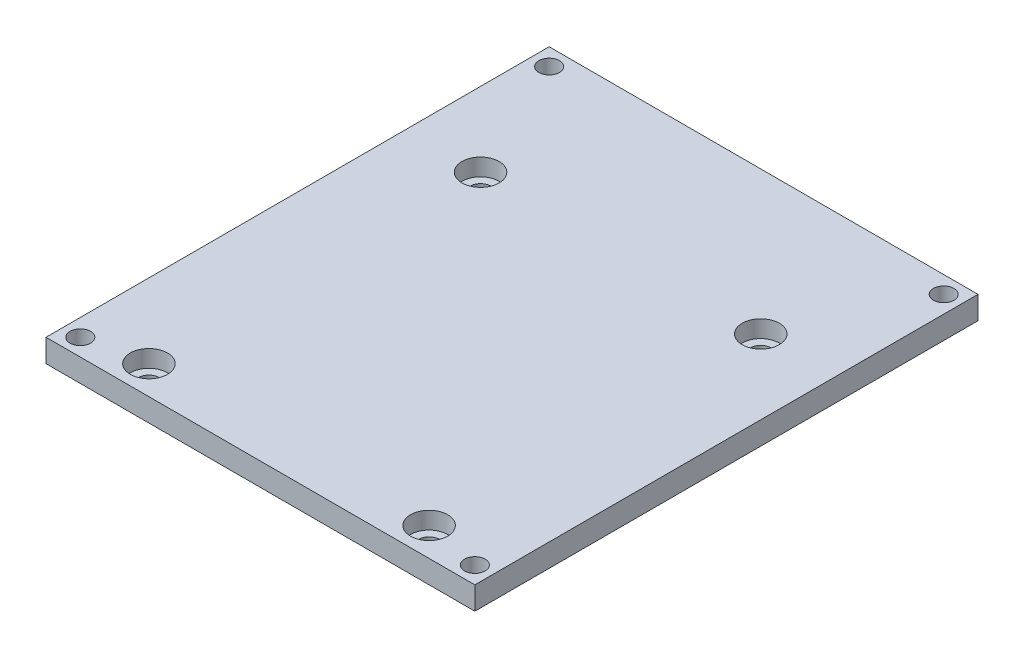
ISO-10303-21;
HEADER;
FILE_DESCRIPTION(('STEP AP214'),'2;1');
FILE_NAME('part.step','',(''),(''),'','','');
FILE_SCHEMA(('AUTOMOTIVE_DESIGN { 1 0 10303 214 1 1 1 1 }'));
ENDSEC;
DATA;
#1=APPLICATION_CONTEXT('core data for automotive mechanical design processes');
#2=APPLICATION_PROTOCOL_DEFINITION('international standard','automotive_design',2000,#1);
#3=PRODUCT_CONTEXT('',#1,'mechanical');
#4=PRODUCT('Part','Part','',(#3));
#5=PRODUCT_RELATED_PRODUCT_CATEGORY('part','',(#4));
#6=PRODUCT_DEFINITION_FORMATION('','',#4);
#7=PRODUCT_DEFINITION_CONTEXT('part definition',#1,'design');
#8=PRODUCT_DEFINITION('design','',#6,#7);
#9=PRODUCT_DEFINITION_SHAPE('','',#8);
#10=(LENGTH_UNIT() NAMED_UNIT(*) SI_UNIT(.MILLI.,.METRE.));
#11=(NAMED_UNIT(*) PLANE_ANGLE_UNIT() SI_UNIT($,.RADIAN.));
#12=(NAMED_UNIT(*) SI_UNIT($,.STERADIAN.) SOLID_ANGLE_UNIT());
#13=UNCERTAINTY_MEASURE_WITH_UNIT(LENGTH_MEASURE(1.E-05),#10,'distance_accuracy_value','');
#14=(GEOMETRIC_REPRESENTATION_CONTEXT(3) GLOBAL_UNCERTAINTY_ASSIGNED_CONTEXT((#13)) GLOBAL_UNIT_ASSIGNED_CONTEXT((#10,
#11,#12)) REPRESENTATION_CONTEXT('',''));
#15=CARTESIAN_POINT('',(0.,0.,0.));
#16=DIRECTION('',(0.,0.,1.));
#17=DIRECTION('',(1.,0.,0.));
#18=AXIS2_PLACEMENT_3D('',#15,#16,#17);
#19=CARTESIAN_POINT('',(37.5,4.,44.));
#20=DIRECTION('',(-1.,0.,0.));
#21=DIRECTION('',(0.,0.,1.));
#22=AXIS2_PLACEMENT_3D('',#19,#20,#21);
#23=PLANE('',#22);
#24=DIRECTION('',(0.,0.,-1.));
#25=VECTOR('',#24,1.);
#26=CARTESIAN_POINT('',(37.5,0.,44.));
#27=LINE('',#26,#25);
#28=CARTESIAN_POINT('',(37.5,0.,44.));
#29=VERTEX_POINT('',#28);
#30=CARTESIAN_POINT('',(37.5,0.,-44.));
#31=VERTEX_POINT('',#30);
#32=EDGE_CURVE('E102',#29,#31,#27,.T.);
#33=ORIENTED_EDGE('',*,*,#32,.T.);
#34=DIRECTION('',(0.,-1.,0.));
#35=VECTOR('',#34,1.);
#36=CARTESIAN_POINT('',(37.5,4.,-44.));
#37=LINE('',#36,#35);
#38=CARTESIAN_POINT('',(37.5,4.,-44.));
#39=VERTEX_POINT('',#38);
#40=EDGE_CURVE('E11',#39,#31,#37,.T.);
#41=ORIENTED_EDGE('',*,*,#40,.F.);
#42=DIRECTION('',(0.,0.,-1.));
#43=VECTOR('',#42,1.);
#44=CARTESIAN_POINT('',(37.5,4.,44.));
#45=LINE('',#44,#43);
#46=CARTESIAN_POINT('',(37.5,4.,44.));
#47=VERTEX_POINT('',#46);
#48=EDGE_CURVE('E90',#47,#39,#45,.T.);
#49=ORIENTED_EDGE('',*,*,#48,.F.);
#50=DIRECTION('',(0.,-1.,0.));
#51=VECTOR('',#50,1.);
#52=CARTESIAN_POINT('',(37.5,4.,44.));
#53=LINE('',#52,#51);
#54=EDGE_CURVE('E98',#47,#29,#53,.T.);
#55=ORIENTED_EDGE('',*,*,#54,.T.);
#56=EDGE_LOOP('',(#33,#41,#49,#55));
#57=FACE_BOUND('',#56,.T.);
#58=ADVANCED_FACE('F39',(#57),#23,.F.);
#59=CARTESIAN_POINT('',(-37.5,4.,-44.));
#60=DIRECTION('',(0.,0.,1.));
#61=DIRECTION('',(1.,0.,0.));
#62=AXIS2_PLACEMENT_3D('',#59,#60,#61);
#63=PLANE('',#62);
#64=DIRECTION('',(-1.,0.,0.));
#65=VECTOR('',#64,1.);
#66=CARTESIAN_POINT('',(-37.5,0.,-44.));
#67=LINE('',#66,#65);
#68=CARTESIAN_POINT('',(-37.5,0.,-44.));
#69=VERTEX_POINT('',#68);
#70=EDGE_CURVE('E94',#31,#69,#67,.T.);
#71=ORIENTED_EDGE('',*,*,#70,.T.);
#72=DIRECTION('',(0.,-1.,0.));
#73=VECTOR('',#72,1.);
#74=CARTESIAN_POINT('',(-37.5,4.,-44.));
#75=LINE('',#74,#73);
#76=CARTESIAN_POINT('',(-37.5,4.,-44.));
#77=VERTEX_POINT('',#76);
#78=EDGE_CURVE('E47',#77,#69,#75,.T.);
#79=ORIENTED_EDGE('',*,*,#78,.F.);
#80=DIRECTION('',(-1.,0.,0.));
#81=VECTOR('',#80,1.);
#82=CARTESIAN_POINT('',(-37.5,4.,-44.));
#83=LINE('',#82,#81);
#84=EDGE_CURVE('E85',#39,#77,#83,.T.);
#85=ORIENTED_EDGE('',*,*,#84,.F.);
#86=ORIENTED_EDGE('',*,*,#40,.T.);
#87=EDGE_LOOP('',(#71,#79,#85,#86));
#88=FACE_BOUND('',#87,.T.);
#89=ADVANCED_FACE('F93',(#88),#63,.F.);
#90=CARTESIAN_POINT('',(-37.5,4.,44.));
#91=DIRECTION('',(1.,0.,0.));
#92=DIRECTION('',(0.,0.,-1.));
#93=AXIS2_PLACEMENT_3D('',#90,#91,#92);
#94=PLANE('',#93);
#95=DIRECTION('',(0.,0.,1.));
#96=VECTOR('',#95,1.);
#97=CARTESIAN_POINT('',(-37.5,0.,44.));
#98=LINE('',#97,#96);
#99=CARTESIAN_POINT('',(-37.5,0.,44.));
#100=VERTEX_POINT('',#99);
#101=EDGE_CURVE('E72',#69,#100,#98,.T.);
#102=ORIENTED_EDGE('',*,*,#101,.T.);
#103=DIRECTION('',(0.,-1.,0.));
#104=VECTOR('',#103,1.);
#105=CARTESIAN_POINT('',(-37.5,4.,44.));
#106=LINE('',#105,#104);
#107=CARTESIAN_POINT('',(-37.5,4.,44.));
#108=VERTEX_POINT('',#107);
#109=EDGE_CURVE('E95',#108,#100,#106,.T.);
#110=ORIENTED_EDGE('',*,*,#109,.F.);
#111=DIRECTION('',(0.,0.,1.));
#112=VECTOR('',#111,1.);
#113=CARTESIAN_POINT('',(-37.5,4.,44.));
#114=LINE('',#113,#112);
#115=EDGE_CURVE('E88',#77,#108,#114,.T.);
#116=ORIENTED_EDGE('',*,*,#115,.F.);
#117=ORIENTED_EDGE('',*,*,#78,.T.);
#118=EDGE_LOOP('',(#102,#110,#116,#117));
#119=FACE_BOUND('',#118,.T.);
#120=ADVANCED_FACE('F96',(#119),#94,.F.);
#121=CARTESIAN_POINT('',(-37.5,4.,44.));
#122=DIRECTION('',(0.,0.,-1.));
#123=DIRECTION('',(-1.,0.,0.));
#124=AXIS2_PLACEMENT_3D('',#121,#122,#123);
#125=PLANE('',#124);
#126=DIRECTION('',(1.,0.,0.));
#127=VECTOR('',#126,1.);
#128=CARTESIAN_POINT('',(-37.5,0.,44.));
#129=LINE('',#128,#127);
#130=EDGE_CURVE('E78',#100,#29,#129,.T.);
#131=ORIENTED_EDGE('',*,*,#130,.T.);
#132=ORIENTED_EDGE('',*,*,#54,.F.);
#133=DIRECTION('',(1.,0.,0.));
#134=VECTOR('',#133,1.);
#135=CARTESIAN_POINT('',(-37.5,4.,44.));
#136=LINE('',#135,#134);
#137=EDGE_CURVE('E55',#108,#47,#136,.T.);
#138=ORIENTED_EDGE('',*,*,#137,.F.);
#139=ORIENTED_EDGE('',*,*,#109,.T.);
#140=EDGE_LOOP('',(#131,#132,#138,#139));
#141=FACE_BOUND('',#140,.T.);
#142=ADVANCED_FACE('F110',(#141),#125,.F.);
#143=CARTESIAN_POINT('',(0.,4.,0.));
#144=DIRECTION('',(0.,-1.,0.));
#145=DIRECTION('',(0.,0.,-1.));
#146=AXIS2_PLACEMENT_3D('',#143,#144,#145);
#147=PLANE('',#146);
#148=CARTESIAN_POINT('',(-34.5,4.,-41.));
#149=DIRECTION('',(0.,1.,0.));
#150=DIRECTION('',(0.,0.,1.));
#151=AXIS2_PLACEMENT_3D('',#148,#149,#150);
#152=CIRCLE('',#151,1.8);
#153=CARTESIAN_POINT('',(-34.5,4.,-39.2));
#154=VERTEX_POINT('',#153);
#155=EDGE_CURVE('E184',#154,#154,#152,.T.);
#156=ORIENTED_EDGE('',*,*,#155,.F.);
#157=EDGE_LOOP('',(#156));
#158=FACE_BOUND('',#157,.T.);
#159=CARTESIAN_POINT('',(34.5,4.,41.));
#160=DIRECTION('',(0.,1.,0.));
#161=DIRECTION('',(0.,0.,1.));
#162=AXIS2_PLACEMENT_3D('',#159,#160,#161);
#163=CIRCLE('',#162,1.8);
#164=CARTESIAN_POINT('',(34.5,4.,42.8));
#165=VERTEX_POINT('',#164);
#166=EDGE_CURVE('E178',#165,#165,#163,.T.);
#167=ORIENTED_EDGE('',*,*,#166,.F.);
#168=EDGE_LOOP('',(#167));
#169=FACE_BOUND('',#168,.T.);
#170=CARTESIAN_POINT('',(34.5,4.,-41.));
#171=DIRECTION('',(0.,1.,0.));
#172=DIRECTION('',(0.,0.,1.));
#173=AXIS2_PLACEMENT_3D('',#170,#171,#172);
#174=CIRCLE('',#173,1.8);
#175=CARTESIAN_POINT('',(34.5,4.,-39.2));
#176=VERTEX_POINT('',#175);
#177=EDGE_CURVE('E172',#176,#176,#174,.T.);
#178=ORIENTED_EDGE('',*,*,#177,.F.);
#179=EDGE_LOOP('',(#178));
#180=FACE_BOUND('',#179,.T.);
#181=CARTESIAN_POINT('',(-34.5,4.,41.));
#182=DIRECTION('',(0.,1.,0.));
#183=DIRECTION('',(0.,0.,1.));
#184=AXIS2_PLACEMENT_3D('',#181,#182,#183);
#185=CIRCLE('',#184,1.8);
#186=CARTESIAN_POINT('',(-34.5,4.,42.8));
#187=VERTEX_POINT('',#186);
#188=EDGE_CURVE('E166',#187,#187,#185,.T.);
#189=ORIENTED_EDGE('',*,*,#188,.F.);
#190=EDGE_LOOP('',(#189));
#191=FACE_BOUND('',#190,.T.);
#192=CARTESIAN_POINT('',(24.5,4.,-19.));
#193=DIRECTION('',(0.,1.,0.));
#194=DIRECTION('',(0.,0.,1.));
#195=AXIS2_PLACEMENT_3D('',#192,#193,#194);
#196=CIRCLE('',#195,3.25);
#197=CARTESIAN_POINT('',(24.5,4.,-15.75));
#198=VERTEX_POINT('',#197);
#199=EDGE_CURVE('E160',#198,#198,#196,.T.);
#200=ORIENTED_EDGE('',*,*,#199,.F.);
#201=EDGE_LOOP('',(#200));
#202=FACE_BOUND('',#201,.T.);
#203=CARTESIAN_POINT('',(-24.5,4.,39.));
#204=DIRECTION('',(0.,1.,0.));
#205=DIRECTION('',(0.,0.,1.));
#206=AXIS2_PLACEMENT_3D('',#203,#204,#205);
#207=CIRCLE('',#206,3.25);
#208=CARTESIAN_POINT('',(-24.5,4.,42.25));
#209=VERTEX_POINT('',#208);
#210=EDGE_CURVE('E148',#209,#209,#207,.T.);
#211=ORIENTED_EDGE('',*,*,#210,.F.);
#212=EDGE_LOOP('',(#211));
#213=FACE_BOUND('',#212,.T.);
#214=CARTESIAN_POINT('',(-24.5,4.,-19.));
#215=DIRECTION('',(0.,1.,0.));
#216=DIRECTION('',(0.,0.,1.));
#217=AXIS2_PLACEMENT_3D('',#214,#215,#216);
#218=CIRCLE('',#217,3.25);
#219=CARTESIAN_POINT('',(-24.5,4.,-15.75));
#220=VERTEX_POINT('',#219);
#221=EDGE_CURVE('E136',#220,#220,#218,.T.);
#222=ORIENTED_EDGE('',*,*,#221,.F.);
#223=EDGE_LOOP('',(#222));
#224=FACE_BOUND('',#223,.T.);
#225=CARTESIAN_POINT('',(24.5,4.,39.));
#226=DIRECTION('',(0.,1.,0.));
#227=DIRECTION('',(0.,0.,1.));
#228=AXIS2_PLACEMENT_3D('',#225,#226,#227);
#229=CIRCLE('',#228,3.25);
#230=CARTESIAN_POINT('',(24.5,4.,42.25));
#231=VERTEX_POINT('',#230);
#232=EDGE_CURVE('E124',#231,#231,#229,.T.);
#233=ORIENTED_EDGE('',*,*,#232,.F.);
#234=EDGE_LOOP('',(#233));
#235=FACE_BOUND('',#234,.T.);
#236=ORIENTED_EDGE('',*,*,#48,.T.);
#237=ORIENTED_EDGE('',*,*,#84,.T.);
#238=ORIENTED_EDGE('',*,*,#115,.T.);
#239=ORIENTED_EDGE('',*,*,#137,.T.);
#240=EDGE_LOOP('',(#236,#237,#238,#239));
#241=FACE_BOUND('',#240,.T.);
#242=ADVANCED_FACE('F86',(#158,#169,#180,#191,#202,#213,#224,#235,#241),#147,.F.);
#243=CARTESIAN_POINT('',(0.,0.,0.));
#244=DIRECTION('',(0.,-1.,0.));
#245=DIRECTION('',(0.,0.,-1.));
#246=AXIS2_PLACEMENT_3D('',#243,#244,#245);
#247=PLANE('',#246);
#248=CARTESIAN_POINT('',(-34.5,0.,-41.));
#249=DIRECTION('',(0.,1.,0.));
#250=DIRECTION('',(0.,0.,1.));
#251=AXIS2_PLACEMENT_3D('',#248,#249,#250);
#252=CIRCLE('',#251,1.8);
#253=CARTESIAN_POINT('',(-34.5,0.,-39.2));
#254=VERTEX_POINT('',#253);
#255=EDGE_CURVE('E181',#254,#254,#252,.T.);
#256=ORIENTED_EDGE('',*,*,#255,.T.);
#257=EDGE_LOOP('',(#256));
#258=FACE_BOUND('',#257,.T.);
#259=CARTESIAN_POINT('',(34.5,0.,41.));
#260=DIRECTION('',(0.,1.,0.));
#261=DIRECTION('',(0.,0.,1.));
#262=AXIS2_PLACEMENT_3D('',#259,#260,#261);
#263=CIRCLE('',#262,1.8);
#264=CARTESIAN_POINT('',(34.5,0.,42.8));
#265=VERTEX_POINT('',#264);
#266=EDGE_CURVE('E175',#265,#265,#263,.T.);
#267=ORIENTED_EDGE('',*,*,#266,.T.);
#268=EDGE_LOOP('',(#267));
#269=FACE_BOUND('',#268,.T.);
#270=CARTESIAN_POINT('',(34.5,0.,-41.));
#271=DIRECTION('',(0.,1.,0.));
#272=DIRECTION('',(0.,0.,1.));
#273=AXIS2_PLACEMENT_3D('',#270,#271,#272);
#274=CIRCLE('',#273,1.8);
#275=CARTESIAN_POINT('',(34.5,0.,-39.2));
#276=VERTEX_POINT('',#275);
#277=EDGE_CURVE('E169',#276,#276,#274,.T.);
#278=ORIENTED_EDGE('',*,*,#277,.T.);
#279=EDGE_LOOP('',(#278));
#280=FACE_BOUND('',#279,.T.);
#281=CARTESIAN_POINT('',(-34.5,0.,41.));
#282=DIRECTION('',(0.,1.,0.));
#283=DIRECTION('',(0.,0.,1.));
#284=AXIS2_PLACEMENT_3D('',#281,#282,#283);
#285=CIRCLE('',#284,1.8);
#286=CARTESIAN_POINT('',(-34.5,0.,42.8));
#287=VERTEX_POINT('',#286);
#288=EDGE_CURVE('E163',#287,#287,#285,.T.);
#289=ORIENTED_EDGE('',*,*,#288,.T.);
#290=EDGE_LOOP('',(#289));
#291=FACE_BOUND('',#290,.T.);
#292=CARTESIAN_POINT('',(24.5,0.,-19.));
#293=DIRECTION('',(0.,1.,0.));
#294=DIRECTION('',(0.,0.,1.));
#295=AXIS2_PLACEMENT_3D('',#292,#293,#294);
#296=CIRCLE('',#295,1.8);
#297=CARTESIAN_POINT('',(24.5,0.,-17.2));
#298=VERTEX_POINT('',#297);
#299=EDGE_CURVE('E151',#298,#298,#296,.T.);
#300=ORIENTED_EDGE('',*,*,#299,.T.);
#301=EDGE_LOOP('',(#300));
#302=FACE_BOUND('',#301,.T.);
#303=CARTESIAN_POINT('',(-24.5,0.,39.));
#304=DIRECTION('',(0.,1.,0.));
#305=DIRECTION('',(0.,0.,1.));
#306=AXIS2_PLACEMENT_3D('',#303,#304,#305);
#307=CIRCLE('',#306,1.8);
#308=CARTESIAN_POINT('',(-24.5,0.,40.8));
#309=VERTEX_POINT('',#308);
#310=EDGE_CURVE('E139',#309,#309,#307,.T.);
#311=ORIENTED_EDGE('',*,*,#310,.T.);
#312=EDGE_LOOP('',(#311));
#313=FACE_BOUND('',#312,.T.);
#314=CARTESIAN_POINT('',(-24.5,0.,-19.));
#315=DIRECTION('',(0.,1.,0.));
#316=DIRECTION('',(0.,0.,1.));
#317=AXIS2_PLACEMENT_3D('',#314,#315,#316);
#318=CIRCLE('',#317,1.8);
#319=CARTESIAN_POINT('',(-24.5,0.,-17.2));
#320=VERTEX_POINT('',#319);
#321=EDGE_CURVE('E127',#320,#320,#318,.T.);
#322=ORIENTED_EDGE('',*,*,#321,.T.);
#323=EDGE_LOOP('',(#322));
#324=FACE_BOUND('',#323,.T.);
#325=CARTESIAN_POINT('',(24.5,0.,39.));
#326=DIRECTION('',(0.,1.,0.));
#327=DIRECTION('',(0.,0.,1.));
#328=AXIS2_PLACEMENT_3D('',#325,#326,#327);
#329=CIRCLE('',#328,1.8);
#330=CARTESIAN_POINT('',(24.5,0.,40.8));
#331=VERTEX_POINT('',#330);
#332=EDGE_CURVE('E105',#331,#331,#329,.T.);
#333=ORIENTED_EDGE('',*,*,#332,.T.);
#334=EDGE_LOOP('',(#333));
#335=FACE_BOUND('',#334,.T.);
#336=ORIENTED_EDGE('',*,*,#32,.F.);
#337=ORIENTED_EDGE('',*,*,#130,.F.);
#338=ORIENTED_EDGE('',*,*,#101,.F.);
#339=ORIENTED_EDGE('',*,*,#70,.F.);
#340=EDGE_LOOP('',(#336,#337,#338,#339));
#341=FACE_BOUND('',#340,.T.);
#342=ADVANCED_FACE('F113',(#258,#269,#280,#291,#302,#313,#324,#335,#341),#247,.T.);
#343=CARTESIAN_POINT('',(24.5,4.,39.));
#344=DIRECTION('',(0.,1.,0.));
#345=DIRECTION('',(0.,0.,1.));
#346=AXIS2_PLACEMENT_3D('',#343,#344,#345);
#347=CYLINDRICAL_SURFACE('',#346,1.8);
#348=ORIENTED_EDGE('',*,*,#332,.F.);
#349=EDGE_LOOP('',(#348));
#350=FACE_BOUND('',#349,.T.);
#351=CARTESIAN_POINT('',(24.5,1.,39.));
#352=DIRECTION('',(0.,1.,0.));
#353=DIRECTION('',(0.,0.,1.));
#354=AXIS2_PLACEMENT_3D('',#351,#352,#353);
#355=CIRCLE('',#354,1.8);
#356=CARTESIAN_POINT('',(24.5,1.,40.8));
#357=VERTEX_POINT('',#356);
#358=EDGE_CURVE('E118',#357,#357,#355,.T.);
#359=ORIENTED_EDGE('',*,*,#358,.T.);
#360=EDGE_LOOP('',(#359));
#361=FACE_BOUND('',#360,.T.);
#362=ADVANCED_FACE('F220',(#350,#361),#347,.F.);
#363=CARTESIAN_POINT('',(26.3,1.,39.));
#364=DIRECTION('',(0.,-1.,0.));
#365=DIRECTION('',(0.,0.,-1.));
#366=AXIS2_PLACEMENT_3D('',#363,#364,#365);
#367=PLANE('',#366);
#368=ORIENTED_EDGE('',*,*,#358,.F.);
#369=EDGE_LOOP('',(#368));
#370=FACE_BOUND('',#369,.T.);
#371=CARTESIAN_POINT('',(24.5,1.,39.));
#372=DIRECTION('',(0.,1.,0.));
#373=DIRECTION('',(0.,0.,1.));
#374=AXIS2_PLACEMENT_3D('',#371,#372,#373);
#375=CIRCLE('',#374,3.25);
#376=CARTESIAN_POINT('',(24.5,1.,42.25));
#377=VERTEX_POINT('',#376);
#378=EDGE_CURVE('E121',#377,#377,#375,.T.);
#379=ORIENTED_EDGE('',*,*,#378,.T.);
#380=EDGE_LOOP('',(#379));
#381=FACE_BOUND('',#380,.T.);
#382=ADVANCED_FACE('F210',(#370,#381),#367,.F.);
#383=CARTESIAN_POINT('',(24.5,4.,39.));
#384=DIRECTION('',(0.,1.,0.));
#385=DIRECTION('',(0.,0.,1.));
#386=AXIS2_PLACEMENT_3D('',#383,#384,#385);
#387=CYLINDRICAL_SURFACE('',#386,3.25);
#388=ORIENTED_EDGE('',*,*,#378,.F.);
#389=EDGE_LOOP('',(#388));
#390=FACE_BOUND('',#389,.T.);
#391=ORIENTED_EDGE('',*,*,#232,.T.);
#392=EDGE_LOOP('',(#391));
#393=FACE_BOUND('',#392,.T.);
#394=ADVANCED_FACE('F207',(#390,#393),#387,.F.);
#395=CARTESIAN_POINT('',(-24.5,4.,-19.));
#396=DIRECTION('',(0.,1.,0.));
#397=DIRECTION('',(0.,0.,1.));
#398=AXIS2_PLACEMENT_3D('',#395,#396,#397);
#399=CYLINDRICAL_SURFACE('',#398,1.8);
#400=ORIENTED_EDGE('',*,*,#321,.F.);
#401=EDGE_LOOP('',(#400));
#402=FACE_BOUND('',#401,.T.);
#403=CARTESIAN_POINT('',(-24.5,1.,-19.));
#404=DIRECTION('',(0.,1.,0.));
#405=DIRECTION('',(0.,0.,1.));
#406=AXIS2_PLACEMENT_3D('',#403,#404,#405);
#407=CIRCLE('',#406,1.8);
#408=CARTESIAN_POINT('',(-24.5,1.,-17.2));
#409=VERTEX_POINT('',#408);
#410=EDGE_CURVE('E130',#409,#409,#407,.T.);
#411=ORIENTED_EDGE('',*,*,#410,.T.);
#412=EDGE_LOOP('',(#411));
#413=FACE_BOUND('',#412,.T.);
#414=ADVANCED_FACE('F209',(#402,#413),#399,.F.);
#415=CARTESIAN_POINT('',(-22.7,1.,-19.));
#416=DIRECTION('',(0.,-1.,0.));
#417=DIRECTION('',(0.,0.,-1.));
#418=AXIS2_PLACEMENT_3D('',#415,#416,#417);
#419=PLANE('',#418);
#420=ORIENTED_EDGE('',*,*,#410,.F.);
#421=EDGE_LOOP('',(#420));
#422=FACE_BOUND('',#421,.T.);
#423=CARTESIAN_POINT('',(-24.5,1.,-19.));
#424=DIRECTION('',(0.,1.,0.));
#425=DIRECTION('',(0.,0.,1.));
#426=AXIS2_PLACEMENT_3D('',#423,#424,#425);
#427=CIRCLE('',#426,3.25);
#428=CARTESIAN_POINT('',(-24.5,1.,-15.75));
#429=VERTEX_POINT('',#428);
#430=EDGE_CURVE('E133',#429,#429,#427,.T.);
#431=ORIENTED_EDGE('',*,*,#430,.T.);
#432=EDGE_LOOP('',(#431));
#433=FACE_BOUND('',#432,.T.);
#434=ADVANCED_FACE('F217',(#422,#433),#419,.F.);
#435=CARTESIAN_POINT('',(-24.5,4.,-19.));
#436=DIRECTION('',(0.,1.,0.));
#437=DIRECTION('',(0.,0.,1.));
#438=AXIS2_PLACEMENT_3D('',#435,#436,#437);
#439=CYLINDRICAL_SURFACE('',#438,3.25);
#440=ORIENTED_EDGE('',*,*,#430,.F.);
#441=EDGE_LOOP('',(#440));
#442=FACE_BOUND('',#441,.T.);
#443=ORIENTED_EDGE('',*,*,#221,.T.);
#444=EDGE_LOOP('',(#443));
#445=FACE_BOUND('',#444,.T.);
#446=ADVANCED_FACE('F275',(#442,#445),#439,.F.);
#447=CARTESIAN_POINT('',(-24.5,4.,39.));
#448=DIRECTION('',(0.,1.,0.));
#449=DIRECTION('',(0.,0.,1.));
#450=AXIS2_PLACEMENT_3D('',#447,#448,#449);
#451=CYLINDRICAL_SURFACE('',#450,1.8);
#452=ORIENTED_EDGE('',*,*,#310,.F.);
#453=EDGE_LOOP('',(#452));
#454=FACE_BOUND('',#453,.T.);
#455=CARTESIAN_POINT('',(-24.5,1.,39.));
#456=DIRECTION('',(0.,1.,0.));
#457=DIRECTION('',(0.,0.,1.));
#458=AXIS2_PLACEMENT_3D('',#455,#456,#457);
#459=CIRCLE('',#458,1.8);
#460=CARTESIAN_POINT('',(-24.5,1.,40.8));
#461=VERTEX_POINT('',#460);
#462=EDGE_CURVE('E142',#461,#461,#459,.T.);
#463=ORIENTED_EDGE('',*,*,#462,.T.);
#464=EDGE_LOOP('',(#463));
#465=FACE_BOUND('',#464,.T.);
#466=ADVANCED_FACE('F285',(#454,#465),#451,.F.);
#467=CARTESIAN_POINT('',(-22.7,1.,39.));
#468=DIRECTION('',(0.,-1.,0.));
#469=DIRECTION('',(0.,0.,-1.));
#470=AXIS2_PLACEMENT_3D('',#467,#468,#469);
#471=PLANE('',#470);
#472=ORIENTED_EDGE('',*,*,#462,.F.);
#473=EDGE_LOOP('',(#472));
#474=FACE_BOUND('',#473,.T.);
#475=CARTESIAN_POINT('',(-24.5,1.,39.));
#476=DIRECTION('',(0.,1.,0.));
#477=DIRECTION('',(0.,0.,1.));
#478=AXIS2_PLACEMENT_3D('',#475,#476,#477);
#479=CIRCLE('',#478,3.25);
#480=CARTESIAN_POINT('',(-24.5,1.,42.25));
#481=VERTEX_POINT('',#480);
#482=EDGE_CURVE('E145',#481,#481,#479,.T.);
#483=ORIENTED_EDGE('',*,*,#482,.T.);
#484=EDGE_LOOP('',(#483));
#485=FACE_BOUND('',#484,.T.);
#486=ADVANCED_FACE('F295',(#474,#485),#471,.F.);
#487=CARTESIAN_POINT('',(-24.5,4.,39.));
#488=DIRECTION('',(0.,1.,0.));
#489=DIRECTION('',(0.,0.,1.));
#490=AXIS2_PLACEMENT_3D('',#487,#488,#489);
#491=CYLINDRICAL_SURFACE('',#490,3.25);
#492=ORIENTED_EDGE('',*,*,#482,.F.);
#493=EDGE_LOOP('',(#492));
#494=FACE_BOUND('',#493,.T.);
#495=ORIENTED_EDGE('',*,*,#210,.T.);
#496=EDGE_LOOP('',(#495));
#497=FACE_BOUND('',#496,.T.);
#498=ADVANCED_FACE('F305',(#494,#497),#491,.F.);
#499=CARTESIAN_POINT('',(24.5,4.,-19.));
#500=DIRECTION('',(0.,1.,0.));
#501=DIRECTION('',(0.,0.,1.));
#502=AXIS2_PLACEMENT_3D('',#499,#500,#501);
#503=CYLINDRICAL_SURFACE('',#502,1.8);
#504=ORIENTED_EDGE('',*,*,#299,.F.);
#505=EDGE_LOOP('',(#504));
#506=FACE_BOUND('',#505,.T.);
#507=CARTESIAN_POINT('',(24.5,1.,-19.));
#508=DIRECTION('',(0.,1.,0.));
#509=DIRECTION('',(0.,0.,1.));
#510=AXIS2_PLACEMENT_3D('',#507,#508,#509);
#511=CIRCLE('',#510,1.8);
#512=CARTESIAN_POINT('',(24.5,1.,-17.2));
#513=VERTEX_POINT('',#512);
#514=EDGE_CURVE('E154',#513,#513,#511,.T.);
#515=ORIENTED_EDGE('',*,*,#514,.T.);
#516=EDGE_LOOP('',(#515));
#517=FACE_BOUND('',#516,.T.);
#518=ADVANCED_FACE('F315',(#506,#517),#503,.F.);
#519=CARTESIAN_POINT('',(26.3,1.,-19.));
#520=DIRECTION('',(0.,-1.,0.));
#521=DIRECTION('',(0.,0.,-1.));
#522=AXIS2_PLACEMENT_3D('',#519,#520,#521);
#523=PLANE('',#522);
#524=ORIENTED_EDGE('',*,*,#514,.F.);
#525=EDGE_LOOP('',(#524));
#526=FACE_BOUND('',#525,.T.);
#527=CARTESIAN_POINT('',(24.5,1.,-19.));
#528=DIRECTION('',(0.,1.,0.));
#529=DIRECTION('',(0.,0.,1.));
#530=AXIS2_PLACEMENT_3D('',#527,#528,#529);
#531=CIRCLE('',#530,3.25);
#532=CARTESIAN_POINT('',(24.5,1.,-15.75));
#533=VERTEX_POINT('',#532);
#534=EDGE_CURVE('E157',#533,#533,#531,.T.);
#535=ORIENTED_EDGE('',*,*,#534,.T.);
#536=EDGE_LOOP('',(#535));
#537=FACE_BOUND('',#536,.T.);
#538=ADVANCED_FACE('F325',(#526,#537),#523,.F.);
#539=CARTESIAN_POINT('',(24.5,4.,-19.));
#540=DIRECTION('',(0.,1.,0.));
#541=DIRECTION('',(0.,0.,1.));
#542=AXIS2_PLACEMENT_3D('',#539,#540,#541);
#543=CYLINDRICAL_SURFACE('',#542,3.25);
#544=ORIENTED_EDGE('',*,*,#534,.F.);
#545=EDGE_LOOP('',(#544));
#546=FACE_BOUND('',#545,.T.);
#547=ORIENTED_EDGE('',*,*,#199,.T.);
#548=EDGE_LOOP('',(#547));
#549=FACE_BOUND('',#548,.T.);
#550=ADVANCED_FACE('F335',(#546,#549),#543,.F.);
#551=CARTESIAN_POINT('',(-34.5,4.,41.));
#552=DIRECTION('',(0.,1.,0.));
#553=DIRECTION('',(0.,0.,1.));
#554=AXIS2_PLACEMENT_3D('',#551,#552,#553);
#555=CYLINDRICAL_SURFACE('',#554,1.8);
#556=ORIENTED_EDGE('',*,*,#288,.F.);
#557=EDGE_LOOP('',(#556));
#558=FACE_BOUND('',#557,.T.);
#559=ORIENTED_EDGE('',*,*,#188,.T.);
#560=EDGE_LOOP('',(#559));
#561=FACE_BOUND('',#560,.T.);
#562=ADVANCED_FACE('F345',(#558,#561),#555,.F.);
#563=CARTESIAN_POINT('',(34.5,4.,-41.));
#564=DIRECTION('',(0.,1.,0.));
#565=DIRECTION('',(0.,0.,1.));
#566=AXIS2_PLACEMENT_3D('',#563,#564,#565);
#567=CYLINDRICAL_SURFACE('',#566,1.8);
#568=ORIENTED_EDGE('',*,*,#277,.F.);
#569=EDGE_LOOP('',(#568));
#570=FACE_BOUND('',#569,.T.);
#571=ORIENTED_EDGE('',*,*,#177,.T.);
#572=EDGE_LOOP('',(#571));
#573=FACE_BOUND('',#572,.T.);
#574=ADVANCED_FACE('F355',(#570,#573),#567,.F.);
#575=CARTESIAN_POINT('',(34.5,4.,41.));
#576=DIRECTION('',(0.,1.,0.));
#577=DIRECTION('',(0.,0.,1.));
#578=AXIS2_PLACEMENT_3D('',#575,#576,#577);
#579=CYLINDRICAL_SURFACE('',#578,1.8);
#580=ORIENTED_EDGE('',*,*,#266,.F.);
#581=EDGE_LOOP('',(#580));
#582=FACE_BOUND('',#581,.T.);
#583=ORIENTED_EDGE('',*,*,#166,.T.);
#584=EDGE_LOOP('',(#583));
#585=FACE_BOUND('',#584,.T.);
#586=ADVANCED_FACE('F365',(#582,#585),#579,.F.);
#587=CARTESIAN_POINT('',(-34.5,4.,-41.));
#588=DIRECTION('',(0.,1.,0.));
#589=DIRECTION('',(0.,0.,1.));
#590=AXIS2_PLACEMENT_3D('',#587,#588,#589);
#591=CYLINDRICAL_SURFACE('',#590,1.8);
#592=ORIENTED_EDGE('',*,*,#255,.F.);
#593=EDGE_LOOP('',(#592));
#594=FACE_BOUND('',#593,.T.);
#595=ORIENTED_EDGE('',*,*,#155,.T.);
#596=EDGE_LOOP('',(#595));
#597=FACE_BOUND('',#596,.T.);
#598=ADVANCED_FACE('F188',(#594,#597),#591,.F.);
#599=CLOSED_SHELL('',(#58,#89,#120,#142,#242,#342,#362,#382,#394,#414,#434,#446,#466,#486,#498,
#518,#538,#550,#562,#574,#586,#598));
#600=MANIFOLD_SOLID_BREP('B2',#599);
#601=ADVANCED_BREP_SHAPE_REPRESENTATION('',(#18,#600),#14);
#602=SHAPE_DEFINITION_REPRESENTATION(#9,#601);
ENDSEC;
END-ISO-10303-21;
